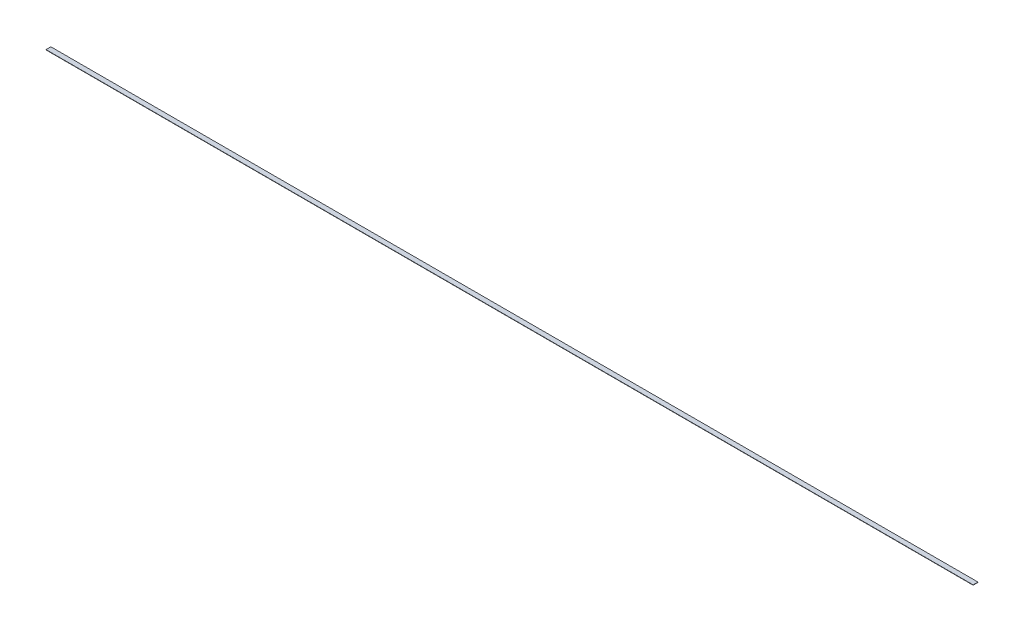
ISO-10303-21;
HEADER;
FILE_DESCRIPTION(('STEP AP214'),'2;1');
FILE_NAME('part.step','',(''),(''),'','','');
FILE_SCHEMA(('AUTOMOTIVE_DESIGN { 1 0 10303 214 1 1 1 1 }'));
ENDSEC;
DATA;
#1=APPLICATION_CONTEXT('core data for automotive mechanical design processes');
#2=APPLICATION_PROTOCOL_DEFINITION('international standard','automotive_design',2000,#1);
#3=PRODUCT_CONTEXT('',#1,'mechanical');
#4=PRODUCT('Part','Part','',(#3));
#5=PRODUCT_RELATED_PRODUCT_CATEGORY('part','',(#4));
#6=PRODUCT_DEFINITION_FORMATION('','',#4);
#7=PRODUCT_DEFINITION_CONTEXT('part definition',#1,'design');
#8=PRODUCT_DEFINITION('design','',#6,#7);
#9=PRODUCT_DEFINITION_SHAPE('','',#8);
#10=(LENGTH_UNIT() NAMED_UNIT(*) SI_UNIT(.MILLI.,.METRE.));
#11=(NAMED_UNIT(*) PLANE_ANGLE_UNIT() SI_UNIT($,.RADIAN.));
#12=(NAMED_UNIT(*) SI_UNIT($,.STERADIAN.) SOLID_ANGLE_UNIT());
#13=UNCERTAINTY_MEASURE_WITH_UNIT(LENGTH_MEASURE(1.E-05),#10,'distance_accuracy_value','');
#14=(GEOMETRIC_REPRESENTATION_CONTEXT(3) GLOBAL_UNCERTAINTY_ASSIGNED_CONTEXT((#13)) GLOBAL_UNIT_ASSIGNED_CONTEXT((#10,
#11,#12)) REPRESENTATION_CONTEXT('',''));
#15=CARTESIAN_POINT('',(0.,0.,0.));
#16=DIRECTION('',(0.,0.,1.));
#17=DIRECTION('',(1.,0.,0.));
#18=AXIS2_PLACEMENT_3D('',#15,#16,#17);
#19=CARTESIAN_POINT('',(0.,3.175,0.));
#20=DIRECTION('',(1.,0.,0.));
#21=DIRECTION('',(0.,0.,-1.));
#22=AXIS2_PLACEMENT_3D('',#19,#20,#21);
#23=PLANE('',#22);
#24=DIRECTION('',(0.,0.,1.));
#25=VECTOR('',#24,1.);
#26=CARTESIAN_POINT('',(0.,0.,0.));
#27=LINE('',#26,#25);
#28=CARTESIAN_POINT('',(0.,0.,-50.8));
#29=VERTEX_POINT('',#28);
#30=CARTESIAN_POINT('',(0.,0.,0.));
#31=VERTEX_POINT('',#30);
#32=EDGE_CURVE('E96',#29,#31,#27,.T.);
#33=ORIENTED_EDGE('',*,*,#32,.T.);
#34=DIRECTION('',(0.,-1.,0.));
#35=VECTOR('',#34,1.);
#36=CARTESIAN_POINT('',(0.,3.175,0.));
#37=LINE('',#36,#35);
#38=CARTESIAN_POINT('',(0.,3.175,0.));
#39=VERTEX_POINT('',#38);
#40=EDGE_CURVE('E11',#39,#31,#37,.T.);
#41=ORIENTED_EDGE('',*,*,#40,.F.);
#42=DIRECTION('',(0.,0.,1.));
#43=VECTOR('',#42,1.);
#44=CARTESIAN_POINT('',(0.,3.175,0.));
#45=LINE('',#44,#43);
#46=CARTESIAN_POINT('',(0.,3.175,-50.8));
#47=VERTEX_POINT('',#46);
#48=EDGE_CURVE('E84',#47,#39,#45,.T.);
#49=ORIENTED_EDGE('',*,*,#48,.F.);
#50=DIRECTION('',(0.,-1.,0.));
#51=VECTOR('',#50,1.);
#52=CARTESIAN_POINT('',(0.,3.175,-50.8));
#53=LINE('',#52,#51);
#54=EDGE_CURVE('E92',#47,#29,#53,.T.);
#55=ORIENTED_EDGE('',*,*,#54,.T.);
#56=EDGE_LOOP('',(#33,#41,#49,#55));
#57=FACE_BOUND('',#56,.T.);
#58=ADVANCED_FACE('F33',(#57),#23,.F.);
#59=CARTESIAN_POINT('',(0.,3.175,0.));
#60=DIRECTION('',(0.,0.,-1.));
#61=DIRECTION('',(-1.,0.,0.));
#62=AXIS2_PLACEMENT_3D('',#59,#60,#61);
#63=PLANE('',#62);
#64=DIRECTION('',(1.,0.,0.));
#65=VECTOR('',#64,1.);
#66=CARTESIAN_POINT('',(0.,0.,0.));
#67=LINE('',#66,#65);
#68=CARTESIAN_POINT('',(9702.8,0.,0.));
#69=VERTEX_POINT('',#68);
#70=EDGE_CURVE('E88',#31,#69,#67,.T.);
#71=ORIENTED_EDGE('',*,*,#70,.T.);
#72=DIRECTION('',(0.,-1.,0.));
#73=VECTOR('',#72,1.);
#74=CARTESIAN_POINT('',(9702.8,3.175,0.));
#75=LINE('',#74,#73);
#76=CARTESIAN_POINT('',(9702.8,3.175,0.));
#77=VERTEX_POINT('',#76);
#78=EDGE_CURVE('E41',#77,#69,#75,.T.);
#79=ORIENTED_EDGE('',*,*,#78,.F.);
#80=DIRECTION('',(1.,0.,0.));
#81=VECTOR('',#80,1.);
#82=CARTESIAN_POINT('',(0.,3.175,0.));
#83=LINE('',#82,#81);
#84=EDGE_CURVE('E79',#39,#77,#83,.T.);
#85=ORIENTED_EDGE('',*,*,#84,.F.);
#86=ORIENTED_EDGE('',*,*,#40,.T.);
#87=EDGE_LOOP('',(#71,#79,#85,#86));
#88=FACE_BOUND('',#87,.T.);
#89=ADVANCED_FACE('F87',(#88),#63,.F.);
#90=CARTESIAN_POINT('',(9702.8,3.175,0.));
#91=DIRECTION('',(-1.,0.,0.));
#92=DIRECTION('',(0.,0.,1.));
#93=AXIS2_PLACEMENT_3D('',#90,#91,#92);
#94=PLANE('',#93);
#95=DIRECTION('',(0.,0.,-1.));
#96=VECTOR('',#95,1.);
#97=CARTESIAN_POINT('',(9702.8,0.,0.));
#98=LINE('',#97,#96);
#99=CARTESIAN_POINT('',(9702.8,0.,-50.8));
#100=VERTEX_POINT('',#99);
#101=EDGE_CURVE('E66',#69,#100,#98,.T.);
#102=ORIENTED_EDGE('',*,*,#101,.T.);
#103=DIRECTION('',(0.,-1.,0.));
#104=VECTOR('',#103,1.);
#105=CARTESIAN_POINT('',(9702.8,3.175,-50.8));
#106=LINE('',#105,#104);
#107=CARTESIAN_POINT('',(9702.8,3.175,-50.8));
#108=VERTEX_POINT('',#107);
#109=EDGE_CURVE('E89',#108,#100,#106,.T.);
#110=ORIENTED_EDGE('',*,*,#109,.F.);
#111=DIRECTION('',(0.,0.,-1.));
#112=VECTOR('',#111,1.);
#113=CARTESIAN_POINT('',(9702.8,3.175,0.));
#114=LINE('',#113,#112);
#115=EDGE_CURVE('E82',#77,#108,#114,.T.);
#116=ORIENTED_EDGE('',*,*,#115,.F.);
#117=ORIENTED_EDGE('',*,*,#78,.T.);
#118=EDGE_LOOP('',(#102,#110,#116,#117));
#119=FACE_BOUND('',#118,.T.);
#120=ADVANCED_FACE('F90',(#119),#94,.F.);
#121=CARTESIAN_POINT('',(0.,3.175,-50.8));
#122=DIRECTION('',(0.,0.,1.));
#123=DIRECTION('',(1.,0.,0.));
#124=AXIS2_PLACEMENT_3D('',#121,#122,#123);
#125=PLANE('',#124);
#126=DIRECTION('',(-1.,0.,0.));
#127=VECTOR('',#126,1.);
#128=CARTESIAN_POINT('',(0.,0.,-50.8));
#129=LINE('',#128,#127);
#130=EDGE_CURVE('E72',#100,#29,#129,.T.);
#131=ORIENTED_EDGE('',*,*,#130,.T.);
#132=ORIENTED_EDGE('',*,*,#54,.F.);
#133=DIRECTION('',(-1.,0.,0.));
#134=VECTOR('',#133,1.);
#135=CARTESIAN_POINT('',(0.,3.175,-50.8));
#136=LINE('',#135,#134);
#137=EDGE_CURVE('E49',#108,#47,#136,.T.);
#138=ORIENTED_EDGE('',*,*,#137,.F.);
#139=ORIENTED_EDGE('',*,*,#109,.T.);
#140=EDGE_LOOP('',(#131,#132,#138,#139));
#141=FACE_BOUND('',#140,.T.);
#142=ADVANCED_FACE('F103',(#141),#125,.F.);
#143=CARTESIAN_POINT('',(0.,3.175,0.));
#144=DIRECTION('',(0.,-1.,0.));
#145=DIRECTION('',(0.,0.,-1.));
#146=AXIS2_PLACEMENT_3D('',#143,#144,#145);
#147=PLANE('',#146);
#148=ORIENTED_EDGE('',*,*,#48,.T.);
#149=ORIENTED_EDGE('',*,*,#84,.T.);
#150=ORIENTED_EDGE('',*,*,#115,.T.);
#151=ORIENTED_EDGE('',*,*,#137,.T.);
#152=EDGE_LOOP('',(#148,#149,#150,#151));
#153=FACE_BOUND('',#152,.T.);
#154=ADVANCED_FACE('F80',(#153),#147,.F.);
#155=CARTESIAN_POINT('',(0.,0.,0.));
#156=DIRECTION('',(0.,-1.,0.));
#157=DIRECTION('',(0.,0.,-1.));
#158=AXIS2_PLACEMENT_3D('',#155,#156,#157);
#159=PLANE('',#158);
#160=ORIENTED_EDGE('',*,*,#32,.F.);
#161=ORIENTED_EDGE('',*,*,#130,.F.);
#162=ORIENTED_EDGE('',*,*,#101,.F.);
#163=ORIENTED_EDGE('',*,*,#70,.F.);
#164=EDGE_LOOP('',(#160,#161,#162,#163));
#165=FACE_BOUND('',#164,.T.);
#166=ADVANCED_FACE('F106',(#165),#159,.T.);
#167=CLOSED_SHELL('',(#58,#89,#120,#142,#154,#166));
#168=MANIFOLD_SOLID_BREP('B2',#167);
#169=ADVANCED_BREP_SHAPE_REPRESENTATION('',(#18,#168),#14);
#170=SHAPE_DEFINITION_REPRESENTATION(#9,#169);
ENDSEC;
END-ISO-10303-21;
